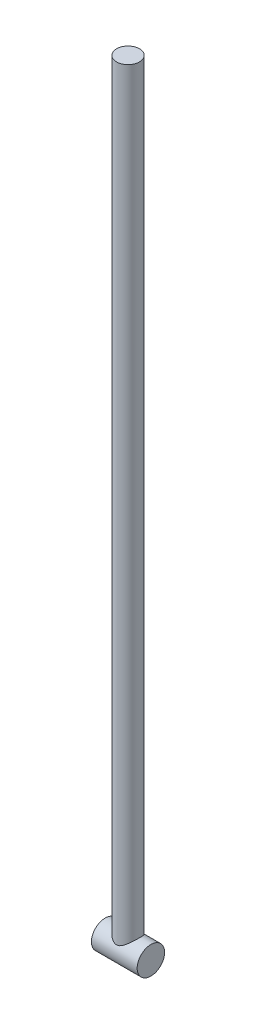
ISO-10303-21;
HEADER;
FILE_DESCRIPTION(('STEP AP214'),'2;1');
FILE_NAME('part.step','',(''),(''),'','','');
FILE_SCHEMA(('AUTOMOTIVE_DESIGN { 1 0 10303 214 1 1 1 1 }'));
ENDSEC;
DATA;
#1=APPLICATION_CONTEXT('core data for automotive mechanical design processes');
#2=APPLICATION_PROTOCOL_DEFINITION('international standard','automotive_design',2000,#1);
#3=PRODUCT_CONTEXT('',#1,'mechanical');
#4=PRODUCT('Part','Part','',(#3));
#5=PRODUCT_RELATED_PRODUCT_CATEGORY('part','',(#4));
#6=PRODUCT_DEFINITION_FORMATION('','',#4);
#7=PRODUCT_DEFINITION_CONTEXT('part definition',#1,'design');
#8=PRODUCT_DEFINITION('design','',#6,#7);
#9=PRODUCT_DEFINITION_SHAPE('','',#8);
#10=(LENGTH_UNIT() NAMED_UNIT(*) SI_UNIT(.MILLI.,.METRE.));
#11=(NAMED_UNIT(*) PLANE_ANGLE_UNIT() SI_UNIT($,.RADIAN.));
#12=(NAMED_UNIT(*) SI_UNIT($,.STERADIAN.) SOLID_ANGLE_UNIT());
#13=UNCERTAINTY_MEASURE_WITH_UNIT(LENGTH_MEASURE(1.E-05),#10,'distance_accuracy_value','');
#14=(GEOMETRIC_REPRESENTATION_CONTEXT(3) GLOBAL_UNCERTAINTY_ASSIGNED_CONTEXT((#13)) GLOBAL_UNIT_ASSIGNED_CONTEXT((#10,
#11,#12)) REPRESENTATION_CONTEXT('',''));
#15=CARTESIAN_POINT('',(0.,0.,0.));
#16=DIRECTION('',(0.,0.,1.));
#17=DIRECTION('',(1.,0.,0.));
#18=AXIS2_PLACEMENT_3D('',#15,#16,#17);
#19=CARTESIAN_POINT('',(-127.,0.,0.));
#20=DIRECTION('',(-1.,0.,0.));
#21=DIRECTION('',(0.,0.,1.));
#22=AXIS2_PLACEMENT_3D('',#19,#20,#21);
#23=CYLINDRICAL_SURFACE('',#22,76.2);
#24=CARTESIAN_POINT('',(127.,0.,0.));
#25=DIRECTION('',(-1.,0.,0.));
#26=DIRECTION('',(0.,0.,1.));
#27=AXIS2_PLACEMENT_3D('',#24,#25,#26);
#28=CIRCLE('',#27,76.2);
#29=CARTESIAN_POINT('',(127.,0.,76.2));
#30=VERTEX_POINT('',#29);
#31=EDGE_CURVE('E57',#30,#30,#28,.T.);
#32=ORIENTED_EDGE('',*,*,#31,.T.);
#33=EDGE_LOOP('',(#32));
#34=FACE_BOUND('',#33,.T.);
#35=CARTESIAN_POINT('',(-127.,0.,0.));
#36=DIRECTION('',(-1.,0.,0.));
#37=DIRECTION('',(0.,0.,1.));
#38=AXIS2_PLACEMENT_3D('',#35,#36,#37);
#39=CIRCLE('',#38,76.2);
#40=CARTESIAN_POINT('',(-127.,0.,76.2));
#41=VERTEX_POINT('',#40);
#42=EDGE_CURVE('E62',#41,#41,#39,.T.);
#43=ORIENTED_EDGE('',*,*,#42,.F.);
#44=EDGE_LOOP('',(#43));
#45=FACE_BOUND('',#44,.T.);
#46=CARTESIAN_POINT('',(-63.5000000000003,76.2,0.));
#47=CARTESIAN_POINT('',(-63.5000056628542,76.2000055043279,0.754260296995974));
#48=CARTESIAN_POINT('',(-63.4865590632073,76.1887983421921,1.50843628641006));
#49=CARTESIAN_POINT('',(-63.4328499957074,76.1440490541002,3.01523524470906));
#50=CARTESIAN_POINT('',(-63.3925867088522,76.1105062459962,3.76785816545782));
#51=CARTESIAN_POINT('',(-63.2854259088506,76.0212750515753,5.2699025769998));
#52=CARTESIAN_POINT('',(-63.2185273854249,75.9655858252408,6.01932394526763));
#53=CARTESIAN_POINT('',(-63.0584034543703,75.8323827458784,7.51347833992148));
#54=CARTESIAN_POINT('',(-62.9651751518632,75.754866493039,8.25821084157164));
#55=CARTESIAN_POINT('',(-62.7527644231131,75.5784091966384,9.74177996626895));
#56=CARTESIAN_POINT('',(-62.6335697533792,75.4794580463596,10.4806136369969));
#57=CARTESIAN_POINT('',(-62.3697843125027,75.2607108792742,11.950647414089));
#58=CARTESIAN_POINT('',(-62.225190863834,75.1409126647934,12.6818467070226));
#59=CARTESIAN_POINT('',(-61.7542402018823,74.7512194176374,14.8617807738844));
#60=CARTESIAN_POINT('',(-61.3906464283539,74.4509705895381,16.2973111717369));
#61=CARTESIAN_POINT('',(-60.5724627201203,73.7777715302795,19.1145523216944));
#62=CARTESIAN_POINT('',(-60.1184377941778,73.4052730715252,20.496536586817));
#63=CARTESIAN_POINT('',(-59.372993812663,72.796441863003,22.530411208733));
#64=CARTESIAN_POINT('',(-59.1137632430995,72.5851388627068,23.2018855823716));
#65=CARTESIAN_POINT('',(-58.5745597402125,72.1466868240564,24.5313170482381));
#66=CARTESIAN_POINT('',(-58.2945838601805,71.9195355348458,25.189272203148));
#67=CARTESIAN_POINT('',(-57.4248082527992,71.2157448126458,27.1416862849116));
#68=CARTESIAN_POINT('',(-56.8050738229619,70.7166975026873,28.414929434451));
#69=CARTESIAN_POINT('',(-55.4921252815609,69.6664244411231,30.9006593567464));
#70=CARTESIAN_POINT('',(-54.7988955593196,69.115187606936,32.1131331409916));
#71=CARTESIAN_POINT('',(-53.5747462111044,68.149469734697,34.1012591031622));
#72=CARTESIAN_POINT('',(-53.0617823262381,67.7468354991837,34.8938471464133));
#73=CARTESIAN_POINT('',(-52.0060000118098,66.9231273190009,36.4487145865899));
#74=CARTESIAN_POINT('',(-51.4631879072935,66.5020572848298,37.2110003462426));
#75=CARTESIAN_POINT('',(-50.3489401548077,65.6435798754251,38.7053389995498));
#76=CARTESIAN_POINT('',(-49.777493596293,65.206166289227,39.4373801723135));
#77=CARTESIAN_POINT('',(-48.6074784231451,64.3174327931902,40.8707593948454));
#78=CARTESIAN_POINT('',(-48.0089082842,63.8661121022466,41.5720957146728));
#79=CARTESIAN_POINT('',(-46.7843310809372,62.9507567607923,42.9456052475667));
#80=CARTESIAN_POINT('',(-46.1582598344763,62.4866934325321,43.6177020626602));
#81=CARTESIAN_POINT('',(-44.8810574580611,61.5492581826856,44.9308309963839));
#82=CARTESIAN_POINT('',(-44.2299266855339,61.0758863939143,45.5718635577932));
#83=CARTESIAN_POINT('',(-42.9034776149141,60.1222577550479,46.8227783596579));
#84=CARTESIAN_POINT('',(-42.228162704234,59.6420018747983,47.4326649338475));
#85=CARTESIAN_POINT('',(-40.8538423421626,58.6769719313059,48.6213846292619));
#86=CARTESIAN_POINT('',(-40.154836646963,58.1921978216019,49.2002174307455));
#87=CARTESIAN_POINT('',(-38.7204552983962,57.2117517922652,50.3371554479604));
#88=CARTESIAN_POINT('',(-37.9846471782418,56.716043422641,50.8946836421121));
#89=CARTESIAN_POINT('',(-36.4890584003563,55.7254650277954,51.9774077014285));
#90=CARTESIAN_POINT('',(-35.7292775808028,55.2305950082568,52.5026033482687));
#91=CARTESIAN_POINT('',(-34.1854549980462,54.2446525662189,53.520649613264));
#92=CARTESIAN_POINT('',(-33.4014048752292,53.7535815267532,54.0134888995914));
#93=CARTESIAN_POINT('',(-31.8090738061076,52.778885495533,54.9662957861611));
#94=CARTESIAN_POINT('',(-31.0007931553657,52.2952604130619,55.4262637871342));
#95=CARTESIAN_POINT('',(-29.3615233824778,51.3404923729843,56.3117814215358));
#96=CARTESIAN_POINT('',(-28.5305928916149,50.8693224447996,56.7374103733629));
#97=CARTESIAN_POINT('',(-26.8435737296753,49.9426725211295,57.5547663974294));
#98=CARTESIAN_POINT('',(-25.9874837267175,49.4871933590561,57.9464916705473));
#99=CARTESIAN_POINT('',(-24.250152712827,48.5973625851988,58.6947526877237));
#100=CARTESIAN_POINT('',(-23.3689300472107,48.1629961585434,59.0513132931465));
#101=CARTESIAN_POINT('',(-21.5803216853506,47.3210089486177,59.7281662844547));
#102=CARTESIAN_POINT('',(-20.6729408084099,46.9133832834765,60.0484652981539));
#103=CARTESIAN_POINT('',(-18.7447540335518,46.0947266067366,60.679549842092));
#104=CARTESIAN_POINT('',(-17.721311352177,45.6869869331701,60.9866017452878));
#105=CARTESIAN_POINT('',(-15.6428134520271,44.9216485486543,61.552515177171));
#106=CARTESIAN_POINT('',(-14.5877625278812,44.5640430631086,61.8113832184606));
#107=CARTESIAN_POINT('',(-12.4497174626129,43.9107291444182,62.2771927362323));
#108=CARTESIAN_POINT('',(-11.3667859368906,43.614893645335,62.4842409882297));
#109=CARTESIAN_POINT('',(-9.17455177264734,43.0955818169289,62.8435430227818));
#110=CARTESIAN_POINT('',(-8.06524935978739,42.8721048686584,62.9957972740401));
#111=CARTESIAN_POINT('',(-5.81250573138842,42.505596679935,63.2436898053765));
#112=CARTESIAN_POINT('',(-4.6688109264056,42.3636083979746,63.3385948621573));
#113=CARTESIAN_POINT('',(-2.37022208174423,42.1722300704491,63.4661842843022));
#114=CARTESIAN_POINT('',(-1.2153290994143,42.122831366392,63.4988744676794));
#115=CARTESIAN_POINT('',(1.09466584328641,42.1195247237706,63.5010682109631));
#116=CARTESIAN_POINT('',(2.24976780410217,42.1656169909894,63.4705716347019));
#117=CARTESIAN_POINT('',(4.54914428050969,42.3505661061078,63.3473087868209));
#118=CARTESIAN_POINT('',(5.69341746000129,42.4894342535617,63.2545349301895));
#119=CARTESIAN_POINT('',(8.05581194044339,42.8674202908911,62.9990498620774));
#120=CARTESIAN_POINT('',(9.27218383235023,43.1138995228935,62.831174893505));
#121=CARTESIAN_POINT('',(11.6729180794312,43.6931122545406,62.4297635760256));
#122=CARTESIAN_POINT('',(12.8572753589897,44.0258593435998,62.1962168816358));
#123=CARTESIAN_POINT('',(15.1926637739397,44.7635492098245,61.6674215624178));
#124=CARTESIAN_POINT('',(16.3435911033273,45.1686936492279,61.3720001800898));
#125=CARTESIAN_POINT('',(18.6071000406992,46.0360804107477,60.7240652300163));
#126=CARTESIAN_POINT('',(19.7196779444994,46.4983282288421,60.3715461658235));
#127=CARTESIAN_POINT('',(21.6816696777049,47.3674848014629,59.690875026598));
#128=CARTESIAN_POINT('',(22.5381839799179,47.766248152043,59.3725995860225));
#129=CARTESIAN_POINT('',(24.2275582128201,48.586201961204,58.7035002698769));
#130=CARTESIAN_POINT('',(25.0604151117564,49.0073952745327,58.3526722469757));
#131=CARTESIAN_POINT('',(26.7032750591983,49.8674732211351,57.6193949937615));
#132=CARTESIAN_POINT('',(27.5132669313011,50.3063662599165,57.2369306467048));
#133=CARTESIAN_POINT('',(29.1105118407275,51.197388953516,56.4413332280633));
#134=CARTESIAN_POINT('',(29.8977657120859,51.6495181216018,56.0282012833622));
#135=CARTESIAN_POINT('',(31.4510724353123,52.5639164319033,55.1712594138509));
#136=CARTESIAN_POINT('',(32.2170954530621,53.0261983541148,54.727409108212));
#137=CARTESIAN_POINT('',(33.7271822287972,53.9570141560045,53.8099219858378));
#138=CARTESIAN_POINT('',(34.4712458636592,54.4255480707155,53.3362850021392));
#139=CARTESIAN_POINT('',(35.937429733878,55.3658067773231,52.3595919308982));
#140=CARTESIAN_POINT('',(36.6595546589451,55.8375308605389,51.8565421989518));
#141=CARTESIAN_POINT('',(38.0820342879549,56.7815843833188,50.8210838044439));
#142=CARTESIAN_POINT('',(38.7823888692321,57.2539138262781,50.2886749765049));
#143=CARTESIAN_POINT('',(40.1972531434812,58.2213785892679,49.1659290935248));
#144=CARTESIAN_POINT('',(40.9105841335959,58.7164131939027,48.5740185599569));
#145=CARTESIAN_POINT('',(42.3125195481158,59.7016808053559,47.3578062615528));
#146=CARTESIAN_POINT('',(43.0011241054463,60.1919138379764,46.7335046708899));
#147=CARTESIAN_POINT('',(44.3530851214736,61.1650714159635,45.4524060227091));
#148=CARTESIAN_POINT('',(45.016437488656,61.6479947693997,44.7956037385456));
#149=CARTESIAN_POINT('',(46.3169313245372,62.6039438825519,43.4495986309494));
#150=CARTESIAN_POINT('',(46.9540724304015,63.0769695052121,42.7603953592828));
#151=CARTESIAN_POINT('',(48.1999269259787,64.0097866610436,41.3509380599024));
#152=CARTESIAN_POINT('',(48.808690204092,64.4696008282196,40.6307431623754));
#153=CARTESIAN_POINT('',(49.9977234430338,65.3744108850793,39.1583076039927));
#154=CARTESIAN_POINT('',(50.5779952339041,65.8194077259049,38.4060690071529));
#155=CARTESIAN_POINT('',(51.7084080484191,66.6919815822946,36.8700341318053));
#156=CARTESIAN_POINT('',(52.2585608358132,67.1195653820122,36.0862503846283));
#157=CARTESIAN_POINT('',(53.3274348277356,67.9550898286709,34.4870981247667));
#158=CARTESIAN_POINT('',(53.8461482961281,68.3630256358867,33.6717219185236));
#159=CARTESIAN_POINT('',(55.106629818995,69.3593146526895,31.5857504325711));
#160=CARTESIAN_POINT('',(55.8270570261275,69.9334370012445,30.2952958798701));
#161=CARTESIAN_POINT('',(57.1847105037866,71.0219445923658,27.6472653366957));
#162=CARTESIAN_POINT('',(57.8219564113548,71.5363439308721,26.2897052928781));
#163=CARTESIAN_POINT('',(58.7097684160789,72.2564675321611,24.2070852073741));
#164=CARTESIAN_POINT('',(58.9943585118147,72.4879258612022,23.505177993692));
#165=CARTESIAN_POINT('',(59.5399543063972,72.9326480453026,22.0866708916828));
#166=CARTESIAN_POINT('',(59.8009638217627,73.1459148443495,21.3700734040955));
#167=CARTESIAN_POINT('',(60.2985126659663,73.5532475684878,19.9229737999445));
#168=CARTESIAN_POINT('',(60.5350495829501,73.747311601002,19.1924703212839));
#169=CARTESIAN_POINT('',(60.9827237855905,74.1152233578158,17.7186493522064));
#170=CARTESIAN_POINT('',(61.1938599699878,74.2890702055799,16.9753313078047));
#171=CARTESIAN_POINT('',(61.5913840715917,74.616860346484,15.4712999768873));
#172=CARTESIAN_POINT('',(61.7775669591561,74.7706385024774,14.7104964079619));
#173=CARTESIAN_POINT('',(62.1224036320326,75.0558034645445,13.1785209197092));
#174=CARTESIAN_POINT('',(62.2810576524152,75.1871904618174,12.4073490889777));
#175=CARTESIAN_POINT('',(62.5700961616474,75.4267883339907,10.8561285380388));
#176=CARTESIAN_POINT('',(62.7004799652856,75.5349986471356,10.0760796031509));
#177=CARTESIAN_POINT('',(62.9323323476998,75.7275662182986,8.50876557592813));
#178=CARTESIAN_POINT('',(63.0338009314189,75.8119234803943,7.72150048482676));
#179=CARTESIAN_POINT('',(63.2072616440536,75.9562084847332,6.1419089078233));
#180=CARTESIAN_POINT('',(63.2792688460972,76.0161487192267,5.34958522128687));
#181=CARTESIAN_POINT('',(63.3935044212569,76.1112698720397,3.76131554416323));
#182=CARTESIAN_POINT('',(63.435733061606,76.1464510125474,2.96536958614683));
#183=CARTESIAN_POINT('',(63.4901857811131,76.19182019357,1.37180990467298));
#184=CARTESIAN_POINT('',(63.502412445576,76.2020103875836,0.574196330844548));
#185=CARTESIAN_POINT('',(63.4968021672285,76.1973351237054,-1.02083682739942));
#186=CARTESIAN_POINT('',(63.4789660943004,76.182470390792,-1.81825641676026));
#187=CARTESIAN_POINT('',(63.4172707542846,76.1310710908587,-3.3153787927065));
#188=CARTESIAN_POINT('',(63.3767921886621,76.0973518544516,-4.01532141847568));
#189=CARTESIAN_POINT('',(63.2727980871915,76.0107633696922,-5.4123656235431));
#190=CARTESIAN_POINT('',(63.2092806094156,75.9578925070683,-6.10946695834146));
#191=CARTESIAN_POINT('',(63.0594762389618,75.8332763929617,-7.49939206837527));
#192=CARTESIAN_POINT('',(62.9731937643708,75.7615348037987,-8.19221664694515));
#193=CARTESIAN_POINT('',(62.7782009386665,75.5995343975161,-9.57254426592487));
#194=CARTESIAN_POINT('',(62.6694884326706,75.5092738012558,-10.2600467884488));
#195=CARTESIAN_POINT('',(62.3103063042838,75.211343160224,-12.3127638621011));
#196=CARTESIAN_POINT('',(62.0267592735437,74.9764969075884,-13.668490217332));
#197=CARTESIAN_POINT('',(61.375650588891,74.4387458217459,-16.3455938143728));
#198=CARTESIAN_POINT('',(61.0080848023896,74.1358376408233,-17.666969363025));
#199=CARTESIAN_POINT('',(60.1883371923493,73.4627148399099,-20.2859965198794));
#200=CARTESIAN_POINT('',(59.7350960624087,73.0916594713761,-21.5830997015163));
#201=CARTESIAN_POINT('',(58.7527270982728,72.2910225693527,-24.129434275841));
#202=CARTESIAN_POINT('',(58.2236009032987,71.861442300091,-25.378666701864));
#203=CARTESIAN_POINT('',(57.0948536852792,70.949992706684,-27.8252244285167));
#204=CARTESIAN_POINT('',(56.4952219327719,70.4681154248953,-29.0225417907205));
#205=CARTESIAN_POINT('',(55.2306426149595,69.4583967481137,-31.362317165447));
#206=CARTESIAN_POINT('',(54.565681944139,68.9305461329142,-32.5047641017939));
#207=CARTESIAN_POINT('',(53.3667393737938,67.9860475157622,-34.4259663505049));
#208=CARTESIAN_POINT('',(52.8470381544549,67.5787468002244,-35.2183255642077));
#209=CARTESIAN_POINT('',(51.777695643865,66.7458411290918,-36.7724035450777));
#210=CARTESIAN_POINT('',(51.2280597137959,66.3202394539775,-37.5341277566408));
#211=CARTESIAN_POINT('',(50.1000677293484,65.4528587530497,-39.027028119582));
#212=CARTESIAN_POINT('',(49.5216997522785,65.0110730317886,-39.758191353646));
#213=CARTESIAN_POINT('',(48.337763825779,64.1138068782532,-41.1894793245009));
#214=CARTESIAN_POINT('',(47.7321945773018,63.6583257922751,-41.8896025757399));
#215=CARTESIAN_POINT('',(46.4933103652049,62.7347348567254,-43.2605837135561));
#216=CARTESIAN_POINT('',(45.8599226439792,62.2665932932153,-43.9313544170571));
#217=CARTESIAN_POINT('',(44.5679602568801,61.3212783040122,-45.2415001636304));
#218=CARTESIAN_POINT('',(43.9093858919532,60.8441049862708,-45.8808755816255));
#219=CARTESIAN_POINT('',(42.5679153903895,59.8832060798698,-47.1281366858268));
#220=CARTESIAN_POINT('',(41.885023041412,59.3994815188124,-47.736027240084));
#221=CARTESIAN_POINT('',(40.4953785738482,58.4278946307558,-48.9204232932885));
#222=CARTESIAN_POINT('',(39.7886262258204,57.9400322640009,-49.49692849029));
#223=CARTESIAN_POINT('',(38.3387675962864,56.9540475426097,-50.6285457977275));
#224=CARTESIAN_POINT('',(37.5952371174228,56.4558977931643,-51.1830905865678));
#225=CARTESIAN_POINT('',(36.0839851852811,55.4609811801761,-52.2595128264863));
#226=CARTESIAN_POINT('',(35.3162635583742,54.9642143265868,-52.7813900430168));
#227=CARTESIAN_POINT('',(33.7562783087515,53.9751084172863,-53.7924527147197));
#228=CARTESIAN_POINT('',(32.9640055792678,53.4827710941568,-54.2816258212444));
#229=CARTESIAN_POINT('',(31.3549307383564,52.5063112164123,-55.22670459691));
#230=CARTESIAN_POINT('',(30.5381289458716,52.0221885551129,-55.6826106983458));
#231=CARTESIAN_POINT('',(28.8817385194043,51.0674842864709,-56.5594462884018));
#232=CARTESIAN_POINT('',(28.0422165069672,50.596869992816,-56.9804658638582));
#233=CARTESIAN_POINT('',(26.3376580966105,49.6724212279305,-57.7881240817729));
#234=CARTESIAN_POINT('',(25.472620257176,49.2185877080051,-58.1747607767994));
#235=CARTESIAN_POINT('',(23.7170818898891,48.3333820158425,-58.9122718239382));
#236=CARTESIAN_POINT('',(22.8266013629073,47.9019929135339,-59.2631733285507));
#237=CARTESIAN_POINT('',(21.0191481537948,47.067527200348,-59.9280606166071));
#238=CARTESIAN_POINT('',(20.1021807011362,46.6644450538578,-60.2420536258899));
#239=CARTESIAN_POINT('',(18.1674572006591,45.8629599782382,-60.8547704084462));
#240=CARTESIAN_POINT('',(17.1474744753059,45.4674621473067,-61.1503094929305));
#241=CARTESIAN_POINT('',(15.0766447069021,44.7276256180638,-61.6935187729788));
#242=CARTESIAN_POINT('',(14.0258019403381,44.3832798709523,-61.9411955654246));
#243=CARTESIAN_POINT('',(11.8972523720307,43.7573165495127,-62.384969267949));
#244=CARTESIAN_POINT('',(10.8196081031901,43.4755658619745,-62.5811757974124));
#245=CARTESIAN_POINT('',(8.63927007861756,42.984875613316,-62.9192308151456));
#246=CARTESIAN_POINT('',(7.53657662529369,42.7759351736857,-63.0610799592798));
#247=CARTESIAN_POINT('',(5.29949775634766,42.4386449180052,-63.2885751901393));
#248=CARTESIAN_POINT('',(4.1648917438962,42.3112777552276,-63.3735365255088));
#249=CARTESIAN_POINT('',(1.88618097446308,42.1480348215757,-63.4822261303926));
#250=CARTESIAN_POINT('',(0.742077023056961,42.1121513693893,-63.505959540833));
#251=CARTESIAN_POINT('',(-1.54509033987851,42.1339454560854,-63.491501731684));
#252=CARTESIAN_POINT('',(-2.68815346755995,42.1916435531161,-63.4532969054019));
#253=CARTESIAN_POINT('',(-4.96241360952491,42.3973106686425,-63.3160559507432));
#254=CARTESIAN_POINT('',(-6.09360903602232,42.5452916133352,-63.2170117855907));
#255=CARTESIAN_POINT('',(-8.45433418148597,42.9438236684222,-62.9470548815187));
#256=CARTESIAN_POINT('',(-9.68154692802168,43.20359971573,-62.7696260638313));
#257=CARTESIAN_POINT('',(-12.1025046444115,43.8096458413943,-62.3481388520553));
#258=CARTESIAN_POINT('',(-13.2962434787969,44.1559316624427,-62.104068330032));
#259=CARTESIAN_POINT('',(-15.6491824836049,44.9204269880619,-61.5533711131775));
#260=CARTESIAN_POINT('',(-16.8082763201426,45.3388356167604,-61.2465707787694));
#261=CARTESIAN_POINT('',(-19.0871399620786,46.2321254461295,-60.5750984348575));
#262=CARTESIAN_POINT('',(-20.2069062824988,46.7070116352434,-60.2104213123691));
#263=CARTESIAN_POINT('',(-22.1822042447916,47.5986415111945,-59.506830410731));
#264=CARTESIAN_POINT('',(-23.0449502632884,48.0074206030204,-59.1778942716879));
#265=CARTESIAN_POINT('',(-24.7462811472497,48.8469122877921,-58.4868761580541));
#266=CARTESIAN_POINT('',(-25.5848629411285,49.2776276500324,-58.1247899938885));
#267=CARTESIAN_POINT('',(-27.2386979381956,50.1562125850818,-57.3683761079683));
#268=CARTESIAN_POINT('',(-28.0539397943041,50.6040902622522,-56.9740330516497));
#269=CARTESIAN_POINT('',(-29.6612169401439,51.5125064147151,-56.1540389867411));
#270=CARTESIAN_POINT('',(-30.4532530794975,51.9730444252798,-55.7283891263834));
#271=CARTESIAN_POINT('',(-32.0156461157671,52.9036611202695,-54.8457336814852));
#272=CARTESIAN_POINT('',(-32.785972723255,53.3737516983702,-54.3886870768823));
#273=CARTESIAN_POINT('',(-34.3041622160763,54.3195452433661,-53.4441177360495));
#274=CARTESIAN_POINT('',(-35.0520249666716,54.7952482439007,-52.9565948170769));
#275=CARTESIAN_POINT('',(-36.5252637344311,55.7491693345973,-51.9514208072918));
#276=CARTESIAN_POINT('',(-37.2506445228852,56.2273868655571,-51.4337761771721));
#277=CARTESIAN_POINT('',(-38.6790411212617,57.1837111893539,-50.3683988387953));
#278=CARTESIAN_POINT('',(-39.3820568404234,57.6618179817338,-49.8206660084605));
#279=CARTESIAN_POINT('',(-40.7995055746805,58.6388369783147,-48.6675006451927));
#280=CARTESIAN_POINT('',(-41.5128004546133,59.1376163391122,-48.0605552754192));
#281=CARTESIAN_POINT('',(-42.9140248525188,60.1295158953924,-46.8136307214013));
#282=CARTESIAN_POINT('',(-43.6019541377548,60.6226360389214,-46.1736512341886));
#283=CARTESIAN_POINT('',(-44.9518000546143,61.6006325389057,-44.8605874811894));
#284=CARTESIAN_POINT('',(-45.6137136415646,62.0855079267141,-44.1874993612598));
#285=CARTESIAN_POINT('',(-46.910568558517,63.0444357184603,-42.808231587834));
#286=CARTESIAN_POINT('',(-47.5455069038373,63.5184869220835,-42.1020482906001));
#287=CARTESIAN_POINT('',(-48.7859786482419,64.4522718784042,-40.6581166124661));
#288=CARTESIAN_POINT('',(-49.3915660779271,64.9120313330886,-39.9204313301742));
#289=CARTESIAN_POINT('',(-50.5732465368038,65.815638886711,-38.4124240939893));
#290=CARTESIAN_POINT('',(-51.1493403191343,66.2594873918584,-37.6421029743921));
#291=CARTESIAN_POINT('',(-52.2703185037893,67.1286148924246,-36.0693219821402));
#292=CARTESIAN_POINT('',(-52.8152121127315,67.5538993568672,-35.2668717102351));
#293=CARTESIAN_POINT('',(-53.8721451371003,68.3834104478559,-33.6302095271599));
#294=CARTESIAN_POINT('',(-54.384186876492,68.787638563562,-32.7959998693386));
#295=CARTESIAN_POINT('',(-55.6119440325444,69.7615858915676,-30.68687363));
#296=CARTESIAN_POINT('',(-56.3069599132359,70.3172289962618,-29.3932312588163));
#297=CARTESIAN_POINT('',(-57.6138116352475,71.3679932048713,-26.7410524707885));
#298=CARTESIAN_POINT('',(-58.2256553316744,71.8631200237353,-25.3825221986115));
#299=CARTESIAN_POINT('',(-59.3584000917623,72.7839334882469,-22.6069549111241));
#300=CARTESIAN_POINT('',(-59.8793958224212,73.2096923871294,-21.1899807242478));
#301=CARTESIAN_POINT('',(-60.8238490612235,73.9841706828461,-18.3033943514897));
#302=CARTESIAN_POINT('',(-61.2473201145714,74.332900777937,-16.8337895082828));
#303=CARTESIAN_POINT('',(-61.9266855374397,74.8937534565101,-14.1053855693336));
#304=CARTESIAN_POINT('',(-62.198836875788,75.119026554335,-12.8533104139954));
#305=CARTESIAN_POINT('',(-62.6680118207199,75.5079627384584,-10.3257770739461));
#306=CARTESIAN_POINT('',(-62.8650451740788,75.6716338177613,-9.05032194537799));
#307=CARTESIAN_POINT('',(-63.1814007054313,75.9346540428672,-6.48330226757175));
#308=CARTESIAN_POINT('',(-63.3007263095984,76.0340060245302,-5.19173843113389));
#309=CARTESIAN_POINT('',(-63.4600258512954,76.1666782327358,-2.60003360446955));
#310=CARTESIAN_POINT('',(-63.4999902406423,76.1999905138456,-1.29989160105619));
#311=CARTESIAN_POINT('',(-63.5000000000003,76.2,0.));
#312=B_SPLINE_CURVE_WITH_KNOTS('',3,(#46,#47,#48,#49,#50,#51,#52,#53,#54,#55,#56,#57,#58,#59,
#60,#61,#62,#63,#64,#65,#66,#67,#68,#69,#70,#71,#72,#73,#74,#75,#76,#77,#78,#79,#80,#81,#82,#83,
#84,#85,#86,#87,#88,#89,#90,#91,#92,#93,#94,#95,#96,#97,#98,#99,#100,#101,#102,#103,#104,#105,
#106,#107,#108,#109,#110,#111,#112,#113,#114,#115,#116,#117,#118,#119,#120,#121,#122,#123,#124,
#125,#126,#127,#128,#129,#130,#131,#132,#133,#134,#135,#136,#137,#138,#139,#140,#141,#142,#143,
#144,#145,#146,#147,#148,#149,#150,#151,#152,#153,#154,#155,#156,#157,#158,#159,#160,#161,#162,
#163,#164,#165,#166,#167,#168,#169,#170,#171,#172,#173,#174,#175,#176,#177,#178,#179,#180,#181,
#182,#183,#184,#185,#186,#187,#188,#189,#190,#191,#192,#193,#194,#195,#196,#197,#198,#199,#200,
#201,#202,#203,#204,#205,#206,#207,#208,#209,#210,#211,#212,#213,#214,#215,#216,#217,#218,#219,
#220,#221,#222,#223,#224,#225,#226,#227,#228,#229,#230,#231,#232,#233,#234,#235,#236,#237,#238,
#239,#240,#241,#242,#243,#244,#245,#246,#247,#248,#249,#250,#251,#252,#253,#254,#255,#256,#257,
#258,#259,#260,#261,#262,#263,#264,#265,#266,#267,#268,#269,#270,#271,#272,#273,#274,#275,#276,
#277,#278,#279,#280,#281,#282,#283,#284,#285,#286,#287,#288,#289,#290,#291,#292,#293,#294,#295,
#296,#297,#298,#299,#300,#301,#302,#303,#304,#305,#306,#307,#308,#309,#310,#311),.UNSPECIFIED.,
.T.,.F.,(4,2,2,2,2,2,2,2,2,2,2,2,2,2,2,2,2,2,2,2,2,2,2,2,2,2,2,2,2,2,2,2,2,2,2,2,2,2,2,2,2,2,2,
2,2,2,2,2,2,2,2,2,2,2,2,2,2,2,2,2,2,2,2,2,2,2,2,2,2,2,2,2,2,2,2,2,2,2,2,2,2,2,2,2,2,2,2,2,2,2,2,
2,2,2,2,2,2,2,2,2,2,2,2,2,2,2,2,2,2,2,2,2,2,2,2,2,2,2,2,2,2,2,2,2,2,2,2,2,2,2,2,2,4),(0.,
2.26243232438287,4.52493374836824,6.78752099761603,9.0503571082762,11.3142624948446,
13.5784066845169,18.1052976800384,22.6047452983455,24.8546977933315,27.1049704913293,
31.604735272028,36.105457741895,39.1835834520807,42.2610593809836,45.3397169674196,
48.4185477857298,51.5049914607405,54.5913911297096,57.6773601722796,60.7633609830354,
63.9061195618573,67.0488993597214,70.1927740127238,73.3366103325113,76.4729635291382,
79.6094830565238,82.7437689289511,85.8774809954553,89.3061750901418,92.7344054203936,
96.1555125670635,99.5765904491574,103.04052997186,106.504145548929,109.967768590104,
113.431813557039,117.183252039297,120.935281829394,124.697930577719,128.460941748902,
131.450745224984,134.440930138567,137.432552194707,140.42406437778,143.419586619194,
146.415125652912,149.410019776611,152.404930772043,155.556644866445,158.70834201521,
161.86054766639,165.012796937901,168.159277665508,171.305556025862,174.450596628591,
177.596408001888,182.348445082457,187.099358288176,189.474730903869,191.849718373982,
194.224939684341,196.600263936343,198.994043500389,201.387802622803,203.78161975849,
206.17543648496,208.568026943007,210.960595929661,213.352958738644,215.745252324451,
217.850385524084,219.955696204614,222.060598599895,224.165703310148,228.374999712427,
232.584503199842,236.849933005326,241.115270685571,245.381258302587,249.648103465892,
252.741344646163,255.834033650005,258.928016898658,262.02214806369,265.124919584862,
268.227654043685,271.329907330408,274.432190457366,277.589979894988,280.747792002405,
283.906789802058,287.065746544147,290.216273784583,293.366979356049,296.515272794367,
299.662948838641,303.060201558569,306.456985699088,309.846475661727,313.235924726229,
316.665471972195,320.09473125115,323.524743977449,326.955209900212,330.750038539843,
334.545558250407,338.351729968266,342.158238120499,345.186458655539,348.215062433615,
351.24511443792,354.275055365089,357.309033119601,360.343029068271,363.376376648163,
366.40973653623,369.592238862332,372.774770381534,375.957673256887,379.140927392926,
382.318079862584,385.495151161129,388.671280079028,391.847184066979,396.552894662439,
401.258160522939,405.958493632249,410.658173517946,414.557456603612,418.456233573722,
422.354838633167,426.253912716923),.UNSPECIFIED.);
#313=CARTESIAN_POINT('',(-63.5000000000003,76.2,0.));
#314=VERTEX_POINT('',#313);
#315=EDGE_CURVE('E44',#314,#314,#312,.T.);
#316=ORIENTED_EDGE('',*,*,#315,.F.);
#317=EDGE_LOOP('',(#316));
#318=FACE_BOUND('',#317,.T.);
#319=ADVANCED_FACE('F39',(#34,#45,#318),#23,.T.);
#320=CARTESIAN_POINT('',(127.,0.,0.));
#321=DIRECTION('',(1.,0.,0.));
#322=DIRECTION('',(0.,0.,-1.));
#323=AXIS2_PLACEMENT_3D('',#320,#321,#322);
#324=PLANE('',#323);
#325=ORIENTED_EDGE('',*,*,#31,.F.);
#326=EDGE_LOOP('',(#325));
#327=FACE_BOUND('',#326,.T.);
#328=ADVANCED_FACE('F71',(#327),#324,.T.);
#329=CARTESIAN_POINT('',(-127.,0.,0.));
#330=DIRECTION('',(1.,0.,0.));
#331=DIRECTION('',(0.,0.,-1.));
#332=AXIS2_PLACEMENT_3D('',#329,#330,#331);
#333=PLANE('',#332);
#334=ORIENTED_EDGE('',*,*,#42,.T.);
#335=EDGE_LOOP('',(#334));
#336=FACE_BOUND('',#335,.T.);
#337=ADVANCED_FACE('F67',(#336),#333,.F.);
#338=CARTESIAN_POINT('',(0.,4287.774,0.));
#339=DIRECTION('',(0.,1.,0.));
#340=DIRECTION('',(-1.,0.,0.));
#341=AXIS2_PLACEMENT_3D('',#338,#339,#340);
#342=CYLINDRICAL_SURFACE('',#341,63.5000000000003);
#343=ORIENTED_EDGE('',*,*,#315,.T.);
#344=EDGE_LOOP('',(#343));
#345=FACE_BOUND('',#344,.T.);
#346=CARTESIAN_POINT('',(0.,4287.774,0.));
#347=DIRECTION('',(0.,1.,0.));
#348=DIRECTION('',(-1.,0.,0.));
#349=AXIS2_PLACEMENT_3D('',#346,#347,#348);
#350=CIRCLE('',#349,63.5);
#351=CARTESIAN_POINT('',(-63.4999999999999,4287.774,0.));
#352=VERTEX_POINT('',#351);
#353=EDGE_CURVE('E10',#352,#352,#350,.T.);
#354=ORIENTED_EDGE('',*,*,#353,.F.);
#355=EDGE_LOOP('',(#354));
#356=FACE_BOUND('',#355,.T.);
#357=ADVANCED_FACE('F41',(#345,#356),#342,.T.);
#358=CARTESIAN_POINT('',(0.,4287.774,0.));
#359=DIRECTION('',(0.,1.,0.));
#360=DIRECTION('',(-1.,0.,0.));
#361=AXIS2_PLACEMENT_3D('',#358,#359,#360);
#362=PLANE('',#361);
#363=ORIENTED_EDGE('',*,*,#353,.T.);
#364=EDGE_LOOP('',(#363));
#365=FACE_BOUND('',#364,.T.);
#366=ADVANCED_FACE('F77',(#365),#362,.T.);
#367=CLOSED_SHELL('',(#319,#328,#337,#357,#366));
#368=MANIFOLD_SOLID_BREP('B2',#367);
#369=ADVANCED_BREP_SHAPE_REPRESENTATION('',(#18,#368),#14);
#370=SHAPE_DEFINITION_REPRESENTATION(#9,#369);
ENDSEC;
END-ISO-10303-21;
